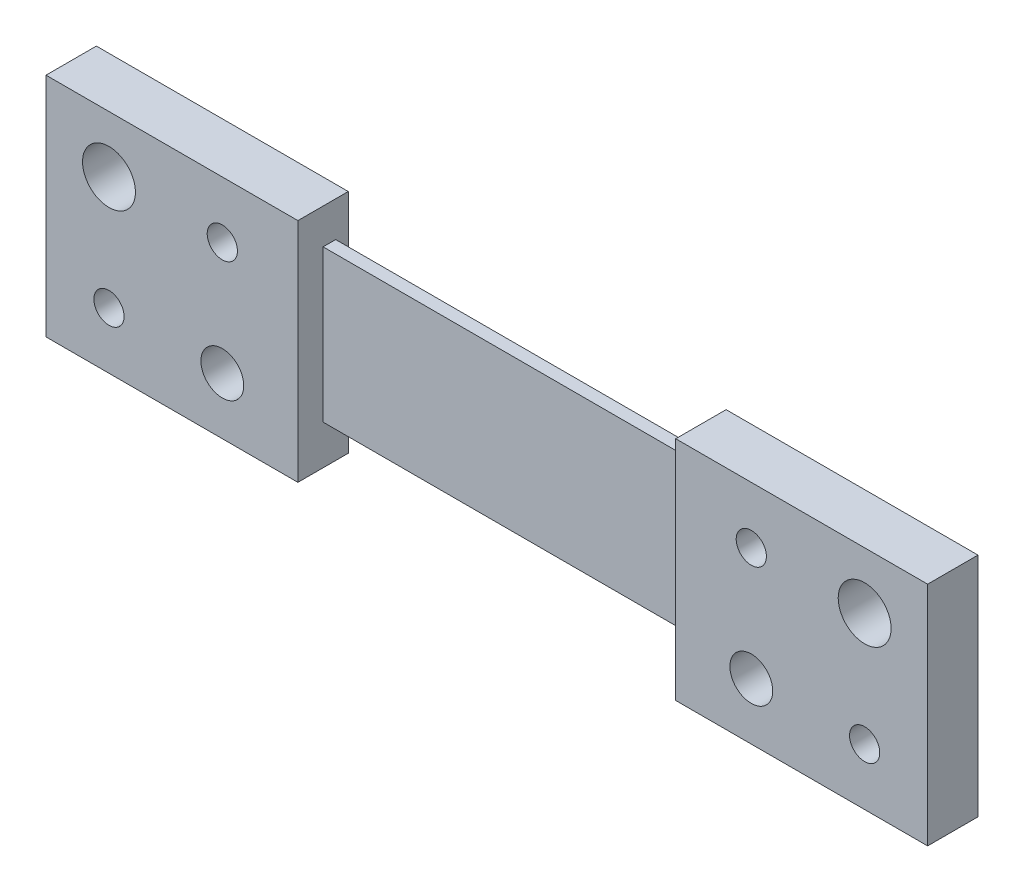
ISO-10303-21;
HEADER;
FILE_DESCRIPTION(('STEP AP214'),'2;1');
FILE_NAME('part.step','',(''),(''),'','','');
FILE_SCHEMA(('AUTOMOTIVE_DESIGN { 1 0 10303 214 1 1 1 1 }'));
ENDSEC;
DATA;
#1=APPLICATION_CONTEXT('core data for automotive mechanical design processes');
#2=APPLICATION_PROTOCOL_DEFINITION('international standard','automotive_design',2000,#1);
#3=PRODUCT_CONTEXT('',#1,'mechanical');
#4=PRODUCT('Part','Part','',(#3));
#5=PRODUCT_RELATED_PRODUCT_CATEGORY('part','',(#4));
#6=PRODUCT_DEFINITION_FORMATION('','',#4);
#7=PRODUCT_DEFINITION_CONTEXT('part definition',#1,'design');
#8=PRODUCT_DEFINITION('design','',#6,#7);
#9=PRODUCT_DEFINITION_SHAPE('','',#8);
#10=(LENGTH_UNIT() NAMED_UNIT(*) SI_UNIT(.MILLI.,.METRE.));
#11=(NAMED_UNIT(*) PLANE_ANGLE_UNIT() SI_UNIT($,.RADIAN.));
#12=(NAMED_UNIT(*) SI_UNIT($,.STERADIAN.) SOLID_ANGLE_UNIT());
#13=UNCERTAINTY_MEASURE_WITH_UNIT(LENGTH_MEASURE(1.E-05),#10,'distance_accuracy_value','');
#14=(GEOMETRIC_REPRESENTATION_CONTEXT(3) GLOBAL_UNCERTAINTY_ASSIGNED_CONTEXT((#13)) GLOBAL_UNIT_ASSIGNED_CONTEXT((#10,
#11,#12)) REPRESENTATION_CONTEXT('',''));
#15=CARTESIAN_POINT('',(0.,0.,0.));
#16=DIRECTION('',(0.,0.,1.));
#17=DIRECTION('',(1.,0.,0.));
#18=AXIS2_PLACEMENT_3D('',#15,#16,#17);
#19=CARTESIAN_POINT('',(16.5251661918329,-5.8576685660019,1.));
#20=DIRECTION('',(0.,1.,0.));
#21=DIRECTION('',(0.,0.,1.));
#22=AXIS2_PLACEMENT_3D('',#19,#20,#21);
#23=PLANE('',#22);
#24=DIRECTION('',(0.,0.,-1.));
#25=VECTOR('',#24,1.);
#26=CARTESIAN_POINT('',(15.,-5.8576685660019,1.));
#27=LINE('',#26,#25);
#28=CARTESIAN_POINT('',(15.,-5.8576685660019,2.));
#29=VERTEX_POINT('',#28);
#30=CARTESIAN_POINT('',(15.,-5.8576685660019,1.));
#31=VERTEX_POINT('',#30);
#32=EDGE_CURVE('E163',#29,#31,#27,.T.);
#33=ORIENTED_EDGE('',*,*,#32,.F.);
#34=DIRECTION('',(-1.,0.,0.));
#35=VECTOR('',#34,1.);
#36=CARTESIAN_POINT('',(16.5251661918329,-5.8576685660019,2.));
#37=LINE('',#36,#35);
#38=CARTESIAN_POINT('',(-15.,-5.8576685660019,2.));
#39=VERTEX_POINT('',#38);
#40=EDGE_CURVE('E172',#29,#39,#37,.T.);
#41=ORIENTED_EDGE('',*,*,#40,.T.);
#42=DIRECTION('',(0.,0.,-1.));
#43=VECTOR('',#42,1.);
#44=CARTESIAN_POINT('',(-15.,-5.8576685660019,4.));
#45=LINE('',#44,#43);
#46=CARTESIAN_POINT('',(-15.,-5.8576685660019,1.));
#47=VERTEX_POINT('',#46);
#48=EDGE_CURVE('E239',#39,#47,#45,.T.);
#49=ORIENTED_EDGE('',*,*,#48,.T.);
#50=DIRECTION('',(-1.,0.,0.));
#51=VECTOR('',#50,1.);
#52=CARTESIAN_POINT('',(16.5251661918329,-5.8576685660019,1.));
#53=LINE('',#52,#51);
#54=EDGE_CURVE('E173',#31,#47,#53,.T.);
#55=ORIENTED_EDGE('',*,*,#54,.F.);
#56=EDGE_LOOP('',(#33,#41,#49,#55));
#57=FACE_BOUND('',#56,.T.);
#58=ADVANCED_FACE('F47',(#57),#23,.F.);
#59=CARTESIAN_POINT('',(16.5251661918329,6.19480056980057,1.));
#60=DIRECTION('',(0.,-1.,0.));
#61=DIRECTION('',(0.,0.,-1.));
#62=AXIS2_PLACEMENT_3D('',#59,#60,#61);
#63=PLANE('',#62);
#64=DIRECTION('',(0.,0.,1.));
#65=VECTOR('',#64,1.);
#66=CARTESIAN_POINT('',(15.,6.19480056980057,1.));
#67=LINE('',#66,#65);
#68=CARTESIAN_POINT('',(15.,6.19480056980057,1.));
#69=VERTEX_POINT('',#68);
#70=CARTESIAN_POINT('',(15.,6.19480056980057,2.));
#71=VERTEX_POINT('',#70);
#72=EDGE_CURVE('E62',#69,#71,#67,.T.);
#73=ORIENTED_EDGE('',*,*,#72,.F.);
#74=DIRECTION('',(1.,0.,0.));
#75=VECTOR('',#74,1.);
#76=CARTESIAN_POINT('',(16.5251661918329,6.19480056980057,1.));
#77=LINE('',#76,#75);
#78=CARTESIAN_POINT('',(-15.,6.19480056980057,1.));
#79=VERTEX_POINT('',#78);
#80=EDGE_CURVE('E175',#79,#69,#77,.T.);
#81=ORIENTED_EDGE('',*,*,#80,.F.);
#82=DIRECTION('',(0.,0.,1.));
#83=VECTOR('',#82,1.);
#84=CARTESIAN_POINT('',(-15.,6.19480056980057,4.));
#85=LINE('',#84,#83);
#86=CARTESIAN_POINT('',(-15.,6.19480056980057,2.));
#87=VERTEX_POINT('',#86);
#88=EDGE_CURVE('E237',#79,#87,#85,.T.);
#89=ORIENTED_EDGE('',*,*,#88,.T.);
#90=DIRECTION('',(1.,0.,0.));
#91=VECTOR('',#90,1.);
#92=CARTESIAN_POINT('',(16.5251661918329,6.19480056980057,2.));
#93=LINE('',#92,#91);
#94=EDGE_CURVE('E68',#87,#71,#93,.T.);
#95=ORIENTED_EDGE('',*,*,#94,.T.);
#96=EDGE_LOOP('',(#73,#81,#89,#95));
#97=FACE_BOUND('',#96,.T.);
#98=ADVANCED_FACE('F251',(#97),#63,.F.);
#99=CARTESIAN_POINT('',(16.5251661918329,6.19480056980057,1.));
#100=DIRECTION('',(0.,0.,1.));
#101=DIRECTION('',(1.,0.,0.));
#102=AXIS2_PLACEMENT_3D('',#99,#100,#101);
#103=PLANE('',#102);
#104=DIRECTION('',(0.,1.,0.));
#105=VECTOR('',#104,1.);
#106=CARTESIAN_POINT('',(15.,6.19480056980057,1.));
#107=LINE('',#106,#105);
#108=EDGE_CURVE('E170',#31,#69,#107,.T.);
#109=ORIENTED_EDGE('',*,*,#108,.F.);
#110=ORIENTED_EDGE('',*,*,#54,.T.);
#111=DIRECTION('',(0.,1.,0.));
#112=VECTOR('',#111,1.);
#113=CARTESIAN_POINT('',(-15.,-9.,1.));
#114=LINE('',#113,#112);
#115=EDGE_CURVE('E55',#47,#79,#114,.T.);
#116=ORIENTED_EDGE('',*,*,#115,.T.);
#117=ORIENTED_EDGE('',*,*,#80,.T.);
#118=EDGE_LOOP('',(#109,#110,#116,#117));
#119=FACE_BOUND('',#118,.T.);
#120=ADVANCED_FACE('F245',(#119),#103,.F.);
#121=CARTESIAN_POINT('',(16.5251661918329,6.19480056980057,2.));
#122=DIRECTION('',(0.,0.,1.));
#123=DIRECTION('',(1.,0.,0.));
#124=AXIS2_PLACEMENT_3D('',#121,#122,#123);
#125=PLANE('',#124);
#126=ORIENTED_EDGE('',*,*,#40,.F.);
#127=DIRECTION('',(0.,1.,0.));
#128=VECTOR('',#127,1.);
#129=CARTESIAN_POINT('',(15.,6.19480056980057,2.));
#130=LINE('',#129,#128);
#131=EDGE_CURVE('E13',#29,#71,#130,.T.);
#132=ORIENTED_EDGE('',*,*,#131,.T.);
#133=ORIENTED_EDGE('',*,*,#94,.F.);
#134=DIRECTION('',(0.,1.,0.));
#135=VECTOR('',#134,1.);
#136=CARTESIAN_POINT('',(-15.,-9.,2.));
#137=LINE('',#136,#135);
#138=EDGE_CURVE('E234',#39,#87,#137,.T.);
#139=ORIENTED_EDGE('',*,*,#138,.F.);
#140=EDGE_LOOP('',(#126,#132,#133,#139));
#141=FACE_BOUND('',#140,.T.);
#142=ADVANCED_FACE('F254',(#141),#125,.T.);
#143=CARTESIAN_POINT('',(-15.,-9.,4.));
#144=DIRECTION('',(-1.,0.,0.));
#145=DIRECTION('',(0.,0.,1.));
#146=AXIS2_PLACEMENT_3D('',#143,#144,#145);
#147=PLANE('',#146);
#148=DIRECTION('',(0.,1.,0.));
#149=VECTOR('',#148,1.);
#150=CARTESIAN_POINT('',(-15.,-9.,0.));
#151=LINE('',#150,#149);
#152=CARTESIAN_POINT('',(-15.,-9.,0.));
#153=VERTEX_POINT('',#152);
#154=CARTESIAN_POINT('',(-15.,9.,0.));
#155=VERTEX_POINT('',#154);
#156=EDGE_CURVE('E220',#153,#155,#151,.T.);
#157=ORIENTED_EDGE('',*,*,#156,.T.);
#158=DIRECTION('',(0.,0.,-1.));
#159=VECTOR('',#158,1.);
#160=CARTESIAN_POINT('',(-15.,9.,4.));
#161=LINE('',#160,#159);
#162=CARTESIAN_POINT('',(-15.,9.,4.));
#163=VERTEX_POINT('',#162);
#164=EDGE_CURVE('E225',#163,#155,#161,.T.);
#165=ORIENTED_EDGE('',*,*,#164,.F.);
#166=DIRECTION('',(0.,1.,0.));
#167=VECTOR('',#166,1.);
#168=CARTESIAN_POINT('',(-15.,-9.,4.));
#169=LINE('',#168,#167);
#170=CARTESIAN_POINT('',(-15.,-9.,4.));
#171=VERTEX_POINT('',#170);
#172=EDGE_CURVE('E211',#171,#163,#169,.T.);
#173=ORIENTED_EDGE('',*,*,#172,.F.);
#174=DIRECTION('',(0.,0.,-1.));
#175=VECTOR('',#174,1.);
#176=CARTESIAN_POINT('',(-15.,-9.,4.));
#177=LINE('',#176,#175);
#178=EDGE_CURVE('E228',#171,#153,#177,.T.);
#179=ORIENTED_EDGE('',*,*,#178,.T.);
#180=EDGE_LOOP('',(#157,#165,#173,#179));
#181=FACE_BOUND('',#180,.T.);
#182=ORIENTED_EDGE('',*,*,#115,.F.);
#183=ORIENTED_EDGE('',*,*,#48,.F.);
#184=ORIENTED_EDGE('',*,*,#138,.T.);
#185=ORIENTED_EDGE('',*,*,#88,.F.);
#186=EDGE_LOOP('',(#182,#183,#184,#185));
#187=FACE_BOUND('',#186,.T.);
#188=ADVANCED_FACE('F252',(#181,#187),#147,.F.);
#189=CARTESIAN_POINT('',(-35.,9.,4.));
#190=DIRECTION('',(0.,0.,-1.));
#191=DIRECTION('',(-1.,0.,0.));
#192=AXIS2_PLACEMENT_3D('',#189,#190,#191);
#193=PLANE('',#192);
#194=CARTESIAN_POINT('',(-21.,-4.5,4.));
#195=DIRECTION('',(0.,0.,1.));
#196=DIRECTION('',(1.,0.,0.));
#197=AXIS2_PLACEMENT_3D('',#194,#195,#196);
#198=CIRCLE('',#197,1.7);
#199=CARTESIAN_POINT('',(-19.3,-4.5,4.));
#200=VERTEX_POINT('',#199);
#201=EDGE_CURVE('E187',#200,#200,#198,.T.);
#202=ORIENTED_EDGE('',*,*,#201,.F.);
#203=EDGE_LOOP('',(#202));
#204=FACE_BOUND('',#203,.T.);
#205=CARTESIAN_POINT('',(-30.,4.5,4.));
#206=DIRECTION('',(0.,0.,1.));
#207=DIRECTION('',(1.,0.,0.));
#208=AXIS2_PLACEMENT_3D('',#205,#206,#207);
#209=CIRCLE('',#208,2.1);
#210=CARTESIAN_POINT('',(-27.9,4.5,4.));
#211=VERTEX_POINT('',#210);
#212=EDGE_CURVE('E199',#211,#211,#209,.T.);
#213=ORIENTED_EDGE('',*,*,#212,.F.);
#214=EDGE_LOOP('',(#213));
#215=FACE_BOUND('',#214,.T.);
#216=DIRECTION('',(0.,-1.,0.));
#217=VECTOR('',#216,1.);
#218=CARTESIAN_POINT('',(-35.,-9.,4.));
#219=LINE('',#218,#217);
#220=CARTESIAN_POINT('',(-35.,9.,4.));
#221=VERTEX_POINT('',#220);
#222=CARTESIAN_POINT('',(-35.,-9.,4.));
#223=VERTEX_POINT('',#222);
#224=EDGE_CURVE('E205',#221,#223,#219,.T.);
#225=ORIENTED_EDGE('',*,*,#224,.T.);
#226=DIRECTION('',(1.,0.,0.));
#227=VECTOR('',#226,1.);
#228=CARTESIAN_POINT('',(-35.,-9.,4.));
#229=LINE('',#228,#227);
#230=EDGE_CURVE('E208',#223,#171,#229,.T.);
#231=ORIENTED_EDGE('',*,*,#230,.T.);
#232=ORIENTED_EDGE('',*,*,#172,.T.);
#233=DIRECTION('',(-1.,0.,0.));
#234=VECTOR('',#233,1.);
#235=CARTESIAN_POINT('',(-35.,9.,4.));
#236=LINE('',#235,#234);
#237=EDGE_CURVE('E213',#163,#221,#236,.T.);
#238=ORIENTED_EDGE('',*,*,#237,.T.);
#239=EDGE_LOOP('',(#225,#231,#232,#238));
#240=FACE_BOUND('',#239,.T.);
#241=CARTESIAN_POINT('',(-21.,4.5,4.));
#242=DIRECTION('',(0.,0.,1.));
#243=DIRECTION('',(1.,0.,0.));
#244=AXIS2_PLACEMENT_3D('',#241,#242,#243);
#245=CIRCLE('',#244,1.2);
#246=CARTESIAN_POINT('',(-19.8,4.5,4.));
#247=VERTEX_POINT('',#246);
#248=EDGE_CURVE('E193',#247,#247,#245,.T.);
#249=ORIENTED_EDGE('',*,*,#248,.F.);
#250=EDGE_LOOP('',(#249));
#251=FACE_BOUND('',#250,.T.);
#252=CARTESIAN_POINT('',(-30.,-4.5,4.));
#253=DIRECTION('',(0.,0.,1.));
#254=DIRECTION('',(1.,0.,0.));
#255=AXIS2_PLACEMENT_3D('',#252,#253,#254);
#256=CIRCLE('',#255,1.2);
#257=CARTESIAN_POINT('',(-28.8,-4.5,4.));
#258=VERTEX_POINT('',#257);
#259=EDGE_CURVE('E181',#258,#258,#256,.T.);
#260=ORIENTED_EDGE('',*,*,#259,.F.);
#261=EDGE_LOOP('',(#260));
#262=FACE_BOUND('',#261,.T.);
#263=ADVANCED_FACE('F294',(#204,#215,#240,#251,#262),#193,.F.);
#264=CARTESIAN_POINT('',(-35.,9.,0.));
#265=DIRECTION('',(0.,0.,-1.));
#266=DIRECTION('',(-1.,0.,0.));
#267=AXIS2_PLACEMENT_3D('',#264,#265,#266);
#268=PLANE('',#267);
#269=CARTESIAN_POINT('',(-21.,-4.5,0.));
#270=DIRECTION('',(0.,0.,1.));
#271=DIRECTION('',(1.,0.,0.));
#272=AXIS2_PLACEMENT_3D('',#269,#270,#271);
#273=CIRCLE('',#272,1.7);
#274=CARTESIAN_POINT('',(-19.3,-4.5,0.));
#275=VERTEX_POINT('',#274);
#276=EDGE_CURVE('E184',#275,#275,#273,.T.);
#277=ORIENTED_EDGE('',*,*,#276,.T.);
#278=EDGE_LOOP('',(#277));
#279=FACE_BOUND('',#278,.T.);
#280=CARTESIAN_POINT('',(-30.,4.5,0.));
#281=DIRECTION('',(0.,0.,1.));
#282=DIRECTION('',(1.,0.,0.));
#283=AXIS2_PLACEMENT_3D('',#280,#281,#282);
#284=CIRCLE('',#283,2.1);
#285=CARTESIAN_POINT('',(-27.9,4.5,0.));
#286=VERTEX_POINT('',#285);
#287=EDGE_CURVE('E196',#286,#286,#284,.T.);
#288=ORIENTED_EDGE('',*,*,#287,.T.);
#289=EDGE_LOOP('',(#288));
#290=FACE_BOUND('',#289,.T.);
#291=DIRECTION('',(0.,-1.,0.));
#292=VECTOR('',#291,1.);
#293=CARTESIAN_POINT('',(-35.,-9.,0.));
#294=LINE('',#293,#292);
#295=CARTESIAN_POINT('',(-35.,9.,0.));
#296=VERTEX_POINT('',#295);
#297=CARTESIAN_POINT('',(-35.,-9.,0.));
#298=VERTEX_POINT('',#297);
#299=EDGE_CURVE('E202',#296,#298,#294,.T.);
#300=ORIENTED_EDGE('',*,*,#299,.F.);
#301=DIRECTION('',(-1.,0.,0.));
#302=VECTOR('',#301,1.);
#303=CARTESIAN_POINT('',(-35.,9.,0.));
#304=LINE('',#303,#302);
#305=EDGE_CURVE('E209',#155,#296,#304,.T.);
#306=ORIENTED_EDGE('',*,*,#305,.F.);
#307=ORIENTED_EDGE('',*,*,#156,.F.);
#308=DIRECTION('',(1.,0.,0.));
#309=VECTOR('',#308,1.);
#310=CARTESIAN_POINT('',(-35.,-9.,0.));
#311=LINE('',#310,#309);
#312=EDGE_CURVE('E218',#298,#153,#311,.T.);
#313=ORIENTED_EDGE('',*,*,#312,.F.);
#314=EDGE_LOOP('',(#300,#306,#307,#313));
#315=FACE_BOUND('',#314,.T.);
#316=CARTESIAN_POINT('',(-21.,4.5,0.));
#317=DIRECTION('',(0.,0.,1.));
#318=DIRECTION('',(1.,0.,0.));
#319=AXIS2_PLACEMENT_3D('',#316,#317,#318);
#320=CIRCLE('',#319,1.2);
#321=CARTESIAN_POINT('',(-19.8,4.5,0.));
#322=VERTEX_POINT('',#321);
#323=EDGE_CURVE('E190',#322,#322,#320,.T.);
#324=ORIENTED_EDGE('',*,*,#323,.T.);
#325=EDGE_LOOP('',(#324));
#326=FACE_BOUND('',#325,.T.);
#327=CARTESIAN_POINT('',(-30.,-4.5,0.));
#328=DIRECTION('',(0.,0.,1.));
#329=DIRECTION('',(1.,0.,0.));
#330=AXIS2_PLACEMENT_3D('',#327,#328,#329);
#331=CIRCLE('',#330,1.2);
#332=CARTESIAN_POINT('',(-28.8,-4.5,0.));
#333=VERTEX_POINT('',#332);
#334=EDGE_CURVE('E178',#333,#333,#331,.T.);
#335=ORIENTED_EDGE('',*,*,#334,.T.);
#336=EDGE_LOOP('',(#335));
#337=FACE_BOUND('',#336,.T.);
#338=ADVANCED_FACE('F297',(#279,#290,#315,#326,#337),#268,.T.);
#339=CARTESIAN_POINT('',(-35.,-9.,4.));
#340=DIRECTION('',(1.,0.,0.));
#341=DIRECTION('',(0.,0.,-1.));
#342=AXIS2_PLACEMENT_3D('',#339,#340,#341);
#343=PLANE('',#342);
#344=ORIENTED_EDGE('',*,*,#299,.T.);
#345=DIRECTION('',(0.,0.,-1.));
#346=VECTOR('',#345,1.);
#347=CARTESIAN_POINT('',(-35.,-9.,4.));
#348=LINE('',#347,#346);
#349=EDGE_CURVE('E231',#223,#298,#348,.T.);
#350=ORIENTED_EDGE('',*,*,#349,.F.);
#351=ORIENTED_EDGE('',*,*,#224,.F.);
#352=DIRECTION('',(0.,0.,-1.));
#353=VECTOR('',#352,1.);
#354=CARTESIAN_POINT('',(-35.,9.,4.));
#355=LINE('',#354,#353);
#356=EDGE_CURVE('E215',#221,#296,#355,.T.);
#357=ORIENTED_EDGE('',*,*,#356,.T.);
#358=EDGE_LOOP('',(#344,#350,#351,#357));
#359=FACE_BOUND('',#358,.T.);
#360=ADVANCED_FACE('F49',(#359),#343,.F.);
#361=CARTESIAN_POINT('',(-35.,-9.,4.));
#362=DIRECTION('',(0.,1.,0.));
#363=DIRECTION('',(0.,0.,1.));
#364=AXIS2_PLACEMENT_3D('',#361,#362,#363);
#365=PLANE('',#364);
#366=ORIENTED_EDGE('',*,*,#312,.T.);
#367=ORIENTED_EDGE('',*,*,#178,.F.);
#368=ORIENTED_EDGE('',*,*,#230,.F.);
#369=ORIENTED_EDGE('',*,*,#349,.T.);
#370=EDGE_LOOP('',(#366,#367,#368,#369));
#371=FACE_BOUND('',#370,.T.);
#372=ADVANCED_FACE('F304',(#371),#365,.F.);
#373=CARTESIAN_POINT('',(-35.,9.,4.));
#374=DIRECTION('',(0.,-1.,0.));
#375=DIRECTION('',(0.,0.,-1.));
#376=AXIS2_PLACEMENT_3D('',#373,#374,#375);
#377=PLANE('',#376);
#378=ORIENTED_EDGE('',*,*,#305,.T.);
#379=ORIENTED_EDGE('',*,*,#356,.F.);
#380=ORIENTED_EDGE('',*,*,#237,.F.);
#381=ORIENTED_EDGE('',*,*,#164,.T.);
#382=EDGE_LOOP('',(#378,#379,#380,#381));
#383=FACE_BOUND('',#382,.T.);
#384=ADVANCED_FACE('F292',(#383),#377,.F.);
#385=CARTESIAN_POINT('',(-30.,4.5,4.));
#386=DIRECTION('',(0.,0.,-1.));
#387=DIRECTION('',(-1.,0.,0.));
#388=AXIS2_PLACEMENT_3D('',#385,#386,#387);
#389=CYLINDRICAL_SURFACE('',#388,2.1);
#390=ORIENTED_EDGE('',*,*,#212,.T.);
#391=EDGE_LOOP('',(#390));
#392=FACE_BOUND('',#391,.T.);
#393=ORIENTED_EDGE('',*,*,#287,.F.);
#394=EDGE_LOOP('',(#393));
#395=FACE_BOUND('',#394,.T.);
#396=ADVANCED_FACE('F288',(#392,#395),#389,.F.);
#397=CARTESIAN_POINT('',(-21.,4.5,4.));
#398=DIRECTION('',(0.,0.,-1.));
#399=DIRECTION('',(-1.,0.,0.));
#400=AXIS2_PLACEMENT_3D('',#397,#398,#399);
#401=CYLINDRICAL_SURFACE('',#400,1.2);
#402=ORIENTED_EDGE('',*,*,#248,.T.);
#403=EDGE_LOOP('',(#402));
#404=FACE_BOUND('',#403,.T.);
#405=ORIENTED_EDGE('',*,*,#323,.F.);
#406=EDGE_LOOP('',(#405));
#407=FACE_BOUND('',#406,.T.);
#408=ADVANCED_FACE('F284',(#404,#407),#401,.F.);
#409=CARTESIAN_POINT('',(-21.,-4.5,4.));
#410=DIRECTION('',(0.,0.,-1.));
#411=DIRECTION('',(-1.,0.,0.));
#412=AXIS2_PLACEMENT_3D('',#409,#410,#411);
#413=CYLINDRICAL_SURFACE('',#412,1.7);
#414=ORIENTED_EDGE('',*,*,#201,.T.);
#415=EDGE_LOOP('',(#414));
#416=FACE_BOUND('',#415,.T.);
#417=ORIENTED_EDGE('',*,*,#276,.F.);
#418=EDGE_LOOP('',(#417));
#419=FACE_BOUND('',#418,.T.);
#420=ADVANCED_FACE('F269',(#416,#419),#413,.F.);
#421=CARTESIAN_POINT('',(-30.,-4.5,4.));
#422=DIRECTION('',(0.,0.,-1.));
#423=DIRECTION('',(-1.,0.,0.));
#424=AXIS2_PLACEMENT_3D('',#421,#422,#423);
#425=CYLINDRICAL_SURFACE('',#424,1.2);
#426=ORIENTED_EDGE('',*,*,#259,.T.);
#427=EDGE_LOOP('',(#426));
#428=FACE_BOUND('',#427,.T.);
#429=ORIENTED_EDGE('',*,*,#334,.F.);
#430=EDGE_LOOP('',(#429));
#431=FACE_BOUND('',#430,.T.);
#432=ADVANCED_FACE('F259',(#428,#431),#425,.F.);
#433=CARTESIAN_POINT('',(15.,-9.,4.));
#434=DIRECTION('',(1.,0.,0.));
#435=DIRECTION('',(0.,0.,-1.));
#436=AXIS2_PLACEMENT_3D('',#433,#434,#435);
#437=PLANE('',#436);
#438=DIRECTION('',(0.,-1.,0.));
#439=VECTOR('',#438,1.);
#440=CARTESIAN_POINT('',(15.,-9.,0.));
#441=LINE('',#440,#439);
#442=CARTESIAN_POINT('',(15.,9.,0.));
#443=VERTEX_POINT('',#442);
#444=CARTESIAN_POINT('',(15.,-9.,0.));
#445=VERTEX_POINT('',#444);
#446=EDGE_CURVE('E157',#443,#445,#441,.T.);
#447=ORIENTED_EDGE('',*,*,#446,.T.);
#448=DIRECTION('',(0.,0.,-1.));
#449=VECTOR('',#448,1.);
#450=CARTESIAN_POINT('',(15.,-9.,4.));
#451=LINE('',#450,#449);
#452=CARTESIAN_POINT('',(15.,-9.,4.));
#453=VERTEX_POINT('',#452);
#454=EDGE_CURVE('E529',#453,#445,#451,.T.);
#455=ORIENTED_EDGE('',*,*,#454,.F.);
#456=DIRECTION('',(0.,-1.,0.));
#457=VECTOR('',#456,1.);
#458=CARTESIAN_POINT('',(15.,-9.,4.));
#459=LINE('',#458,#457);
#460=CARTESIAN_POINT('',(15.,9.,4.));
#461=VERTEX_POINT('',#460);
#462=EDGE_CURVE('E153',#461,#453,#459,.T.);
#463=ORIENTED_EDGE('',*,*,#462,.F.);
#464=DIRECTION('',(0.,0.,-1.));
#465=VECTOR('',#464,1.);
#466=CARTESIAN_POINT('',(15.,9.,4.));
#467=LINE('',#466,#465);
#468=EDGE_CURVE('E165',#461,#443,#467,.T.);
#469=ORIENTED_EDGE('',*,*,#468,.T.);
#470=EDGE_LOOP('',(#447,#455,#463,#469));
#471=FACE_BOUND('',#470,.T.);
#472=ORIENTED_EDGE('',*,*,#32,.T.);
#473=ORIENTED_EDGE('',*,*,#108,.T.);
#474=ORIENTED_EDGE('',*,*,#72,.T.);
#475=ORIENTED_EDGE('',*,*,#131,.F.);
#476=EDGE_LOOP('',(#472,#473,#474,#475));
#477=FACE_BOUND('',#476,.T.);
#478=ADVANCED_FACE('F257',(#471,#477),#437,.F.);
#479=CARTESIAN_POINT('',(15.,-9.,4.));
#480=DIRECTION('',(0.,0.,-1.));
#481=DIRECTION('',(-1.,0.,0.));
#482=AXIS2_PLACEMENT_3D('',#479,#480,#481);
#483=PLANE('',#482);
#484=CARTESIAN_POINT('',(21.,4.5,4.));
#485=DIRECTION('',(0.,0.,1.));
#486=DIRECTION('',(-1.,0.,0.));
#487=AXIS2_PLACEMENT_3D('',#484,#485,#486);
#488=CIRCLE('',#487,1.2);
#489=CARTESIAN_POINT('',(19.8,4.5,4.));
#490=VERTEX_POINT('',#489);
#491=EDGE_CURVE('E510',#490,#490,#488,.T.);
#492=ORIENTED_EDGE('',*,*,#491,.F.);
#493=EDGE_LOOP('',(#492));
#494=FACE_BOUND('',#493,.T.);
#495=CARTESIAN_POINT('',(30.,-4.5,4.));
#496=DIRECTION('',(0.,0.,1.));
#497=DIRECTION('',(-1.,0.,0.));
#498=AXIS2_PLACEMENT_3D('',#495,#496,#497);
#499=CIRCLE('',#498,1.2);
#500=CARTESIAN_POINT('',(28.8,-4.5,4.));
#501=VERTEX_POINT('',#500);
#502=EDGE_CURVE('E522',#501,#501,#499,.T.);
#503=ORIENTED_EDGE('',*,*,#502,.F.);
#504=EDGE_LOOP('',(#503));
#505=FACE_BOUND('',#504,.T.);
#506=DIRECTION('',(1.,0.,0.));
#507=VECTOR('',#506,1.);
#508=CARTESIAN_POINT('',(35.,-9.,4.));
#509=LINE('',#508,#507);
#510=CARTESIAN_POINT('',(35.,-9.,4.));
#511=VERTEX_POINT('',#510);
#512=EDGE_CURVE('E147',#453,#511,#509,.T.);
#513=ORIENTED_EDGE('',*,*,#512,.T.);
#514=DIRECTION('',(0.,1.,0.));
#515=VECTOR('',#514,1.);
#516=CARTESIAN_POINT('',(35.,-9.,4.));
#517=LINE('',#516,#515);
#518=CARTESIAN_POINT('',(35.,9.,4.));
#519=VERTEX_POINT('',#518);
#520=EDGE_CURVE('E136',#511,#519,#517,.T.);
#521=ORIENTED_EDGE('',*,*,#520,.T.);
#522=DIRECTION('',(-1.,0.,0.));
#523=VECTOR('',#522,1.);
#524=CARTESIAN_POINT('',(35.,9.,4.));
#525=LINE('',#524,#523);
#526=EDGE_CURVE('E146',#519,#461,#525,.T.);
#527=ORIENTED_EDGE('',*,*,#526,.T.);
#528=ORIENTED_EDGE('',*,*,#462,.T.);
#529=EDGE_LOOP('',(#513,#521,#527,#528));
#530=FACE_BOUND('',#529,.T.);
#531=CARTESIAN_POINT('',(21.,-4.49999999999999,4.));
#532=DIRECTION('',(0.,0.,1.));
#533=DIRECTION('',(-1.,0.,0.));
#534=AXIS2_PLACEMENT_3D('',#531,#532,#533);
#535=CIRCLE('',#534,1.7);
#536=CARTESIAN_POINT('',(19.3,-4.49999999999999,4.));
#537=VERTEX_POINT('',#536);
#538=EDGE_CURVE('E516',#537,#537,#535,.T.);
#539=ORIENTED_EDGE('',*,*,#538,.F.);
#540=EDGE_LOOP('',(#539));
#541=FACE_BOUND('',#540,.T.);
#542=CARTESIAN_POINT('',(30.,4.5,4.));
#543=DIRECTION('',(0.,0.,1.));
#544=DIRECTION('',(-1.,0.,0.));
#545=AXIS2_PLACEMENT_3D('',#542,#543,#544);
#546=CIRCLE('',#545,2.1);
#547=CARTESIAN_POINT('',(27.9,4.5,4.));
#548=VERTEX_POINT('',#547);
#549=EDGE_CURVE('E501',#548,#548,#546,.T.);
#550=ORIENTED_EDGE('',*,*,#549,.F.);
#551=EDGE_LOOP('',(#550));
#552=FACE_BOUND('',#551,.T.);
#553=ADVANCED_FACE('F150',(#494,#505,#530,#541,#552),#483,.F.);
#554=CARTESIAN_POINT('',(15.,-9.,0.));
#555=DIRECTION('',(0.,0.,-1.));
#556=DIRECTION('',(-1.,0.,0.));
#557=AXIS2_PLACEMENT_3D('',#554,#555,#556);
#558=PLANE('',#557);
#559=CARTESIAN_POINT('',(21.,4.5,0.));
#560=DIRECTION('',(0.,0.,1.));
#561=DIRECTION('',(-1.,0.,0.));
#562=AXIS2_PLACEMENT_3D('',#559,#560,#561);
#563=CIRCLE('',#562,1.2);
#564=CARTESIAN_POINT('',(19.8,4.5,0.));
#565=VERTEX_POINT('',#564);
#566=EDGE_CURVE('E507',#565,#565,#563,.T.);
#567=ORIENTED_EDGE('',*,*,#566,.T.);
#568=EDGE_LOOP('',(#567));
#569=FACE_BOUND('',#568,.T.);
#570=CARTESIAN_POINT('',(30.,-4.5,0.));
#571=DIRECTION('',(0.,0.,1.));
#572=DIRECTION('',(-1.,0.,0.));
#573=AXIS2_PLACEMENT_3D('',#570,#571,#572);
#574=CIRCLE('',#573,1.2);
#575=CARTESIAN_POINT('',(28.8,-4.5,0.));
#576=VERTEX_POINT('',#575);
#577=EDGE_CURVE('E519',#576,#576,#574,.T.);
#578=ORIENTED_EDGE('',*,*,#577,.T.);
#579=EDGE_LOOP('',(#578));
#580=FACE_BOUND('',#579,.T.);
#581=DIRECTION('',(1.,0.,0.));
#582=VECTOR('',#581,1.);
#583=CARTESIAN_POINT('',(35.,-9.,0.));
#584=LINE('',#583,#582);
#585=CARTESIAN_POINT('',(35.,-9.,0.));
#586=VERTEX_POINT('',#585);
#587=EDGE_CURVE('E161',#445,#586,#584,.T.);
#588=ORIENTED_EDGE('',*,*,#587,.F.);
#589=ORIENTED_EDGE('',*,*,#446,.F.);
#590=DIRECTION('',(-1.,0.,0.));
#591=VECTOR('',#590,1.);
#592=CARTESIAN_POINT('',(35.,9.,0.));
#593=LINE('',#592,#591);
#594=CARTESIAN_POINT('',(35.,9.,0.));
#595=VERTEX_POINT('',#594);
#596=EDGE_CURVE('E533',#595,#443,#593,.T.);
#597=ORIENTED_EDGE('',*,*,#596,.F.);
#598=DIRECTION('',(0.,1.,0.));
#599=VECTOR('',#598,1.);
#600=CARTESIAN_POINT('',(35.,-9.,0.));
#601=LINE('',#600,#599);
#602=EDGE_CURVE('E531',#586,#595,#601,.T.);
#603=ORIENTED_EDGE('',*,*,#602,.F.);
#604=EDGE_LOOP('',(#588,#589,#597,#603));
#605=FACE_BOUND('',#604,.T.);
#606=CARTESIAN_POINT('',(21.,-4.49999999999999,0.));
#607=DIRECTION('',(0.,0.,1.));
#608=DIRECTION('',(-1.,0.,0.));
#609=AXIS2_PLACEMENT_3D('',#606,#607,#608);
#610=CIRCLE('',#609,1.7);
#611=CARTESIAN_POINT('',(19.3,-4.49999999999999,0.));
#612=VERTEX_POINT('',#611);
#613=EDGE_CURVE('E513',#612,#612,#610,.T.);
#614=ORIENTED_EDGE('',*,*,#613,.T.);
#615=EDGE_LOOP('',(#614));
#616=FACE_BOUND('',#615,.T.);
#617=CARTESIAN_POINT('',(30.,4.5,0.));
#618=DIRECTION('',(0.,0.,1.));
#619=DIRECTION('',(-1.,0.,0.));
#620=AXIS2_PLACEMENT_3D('',#617,#618,#619);
#621=CIRCLE('',#620,2.1);
#622=CARTESIAN_POINT('',(27.9,4.5,0.));
#623=VERTEX_POINT('',#622);
#624=EDGE_CURVE('E504',#623,#623,#621,.T.);
#625=ORIENTED_EDGE('',*,*,#624,.T.);
#626=EDGE_LOOP('',(#625));
#627=FACE_BOUND('',#626,.T.);
#628=ADVANCED_FACE('F266',(#569,#580,#605,#616,#627),#558,.T.);
#629=CARTESIAN_POINT('',(35.,-9.,4.));
#630=DIRECTION('',(0.,1.,0.));
#631=DIRECTION('',(0.,0.,1.));
#632=AXIS2_PLACEMENT_3D('',#629,#630,#631);
#633=PLANE('',#632);
#634=ORIENTED_EDGE('',*,*,#587,.T.);
#635=DIRECTION('',(0.,0.,-1.));
#636=VECTOR('',#635,1.);
#637=CARTESIAN_POINT('',(35.,-9.,4.));
#638=LINE('',#637,#636);
#639=EDGE_CURVE('E140',#511,#586,#638,.T.);
#640=ORIENTED_EDGE('',*,*,#639,.F.);
#641=ORIENTED_EDGE('',*,*,#512,.F.);
#642=ORIENTED_EDGE('',*,*,#454,.T.);
#643=EDGE_LOOP('',(#634,#640,#641,#642));
#644=FACE_BOUND('',#643,.T.);
#645=ADVANCED_FACE('F159',(#644),#633,.F.);
#646=CARTESIAN_POINT('',(35.,-9.,4.));
#647=DIRECTION('',(-1.,0.,0.));
#648=DIRECTION('',(0.,0.,1.));
#649=AXIS2_PLACEMENT_3D('',#646,#647,#648);
#650=PLANE('',#649);
#651=ORIENTED_EDGE('',*,*,#602,.T.);
#652=DIRECTION('',(0.,0.,-1.));
#653=VECTOR('',#652,1.);
#654=CARTESIAN_POINT('',(35.,9.,4.));
#655=LINE('',#654,#653);
#656=EDGE_CURVE('E143',#519,#595,#655,.T.);
#657=ORIENTED_EDGE('',*,*,#656,.F.);
#658=ORIENTED_EDGE('',*,*,#520,.F.);
#659=ORIENTED_EDGE('',*,*,#639,.T.);
#660=EDGE_LOOP('',(#651,#657,#658,#659));
#661=FACE_BOUND('',#660,.T.);
#662=ADVANCED_FACE('F138',(#661),#650,.F.);
#663=CARTESIAN_POINT('',(35.,9.,4.));
#664=DIRECTION('',(0.,-1.,0.));
#665=DIRECTION('',(0.,0.,-1.));
#666=AXIS2_PLACEMENT_3D('',#663,#664,#665);
#667=PLANE('',#666);
#668=ORIENTED_EDGE('',*,*,#596,.T.);
#669=ORIENTED_EDGE('',*,*,#468,.F.);
#670=ORIENTED_EDGE('',*,*,#526,.F.);
#671=ORIENTED_EDGE('',*,*,#656,.T.);
#672=EDGE_LOOP('',(#668,#669,#670,#671));
#673=FACE_BOUND('',#672,.T.);
#674=ADVANCED_FACE('F445',(#673),#667,.F.);
#675=CARTESIAN_POINT('',(30.,-4.5,4.));
#676=DIRECTION('',(0.,0.,-1.));
#677=DIRECTION('',(-1.,0.,0.));
#678=AXIS2_PLACEMENT_3D('',#675,#676,#677);
#679=CYLINDRICAL_SURFACE('',#678,1.2);
#680=ORIENTED_EDGE('',*,*,#502,.T.);
#681=EDGE_LOOP('',(#680));
#682=FACE_BOUND('',#681,.T.);
#683=ORIENTED_EDGE('',*,*,#577,.F.);
#684=EDGE_LOOP('',(#683));
#685=FACE_BOUND('',#684,.T.);
#686=ADVANCED_FACE('F453',(#682,#685),#679,.F.);
#687=CARTESIAN_POINT('',(21.,-4.49999999999999,4.));
#688=DIRECTION('',(0.,0.,-1.));
#689=DIRECTION('',(-1.,0.,0.));
#690=AXIS2_PLACEMENT_3D('',#687,#688,#689);
#691=CYLINDRICAL_SURFACE('',#690,1.7);
#692=ORIENTED_EDGE('',*,*,#538,.T.);
#693=EDGE_LOOP('',(#692));
#694=FACE_BOUND('',#693,.T.);
#695=ORIENTED_EDGE('',*,*,#613,.F.);
#696=EDGE_LOOP('',(#695));
#697=FACE_BOUND('',#696,.T.);
#698=ADVANCED_FACE('F461',(#694,#697),#691,.F.);
#699=CARTESIAN_POINT('',(21.,4.5,4.));
#700=DIRECTION('',(0.,0.,-1.));
#701=DIRECTION('',(-1.,0.,0.));
#702=AXIS2_PLACEMENT_3D('',#699,#700,#701);
#703=CYLINDRICAL_SURFACE('',#702,1.2);
#704=ORIENTED_EDGE('',*,*,#491,.T.);
#705=EDGE_LOOP('',(#704));
#706=FACE_BOUND('',#705,.T.);
#707=ORIENTED_EDGE('',*,*,#566,.F.);
#708=EDGE_LOOP('',(#707));
#709=FACE_BOUND('',#708,.T.);
#710=ADVANCED_FACE('F470',(#706,#709),#703,.F.);
#711=CARTESIAN_POINT('',(30.,4.5,4.));
#712=DIRECTION('',(0.,0.,-1.));
#713=DIRECTION('',(-1.,0.,0.));
#714=AXIS2_PLACEMENT_3D('',#711,#712,#713);
#715=CYLINDRICAL_SURFACE('',#714,2.1);
#716=ORIENTED_EDGE('',*,*,#549,.T.);
#717=EDGE_LOOP('',(#716));
#718=FACE_BOUND('',#717,.T.);
#719=ORIENTED_EDGE('',*,*,#624,.F.);
#720=EDGE_LOOP('',(#719));
#721=FACE_BOUND('',#720,.T.);
#722=ADVANCED_FACE('F478',(#718,#721),#715,.F.);
#723=CLOSED_SHELL('',(#58,#98,#120,#142,#188,#263,#338,#360,#372,#384,#396,#408,#420,#432,#478,
#553,#628,#645,#662,#674,#686,#698,#710,#722));
#724=MANIFOLD_SOLID_BREP('B2',#723);
#725=ADVANCED_BREP_SHAPE_REPRESENTATION('',(#18,#724),#14);
#726=SHAPE_DEFINITION_REPRESENTATION(#9,#725);
ENDSEC;
END-ISO-10303-21;
